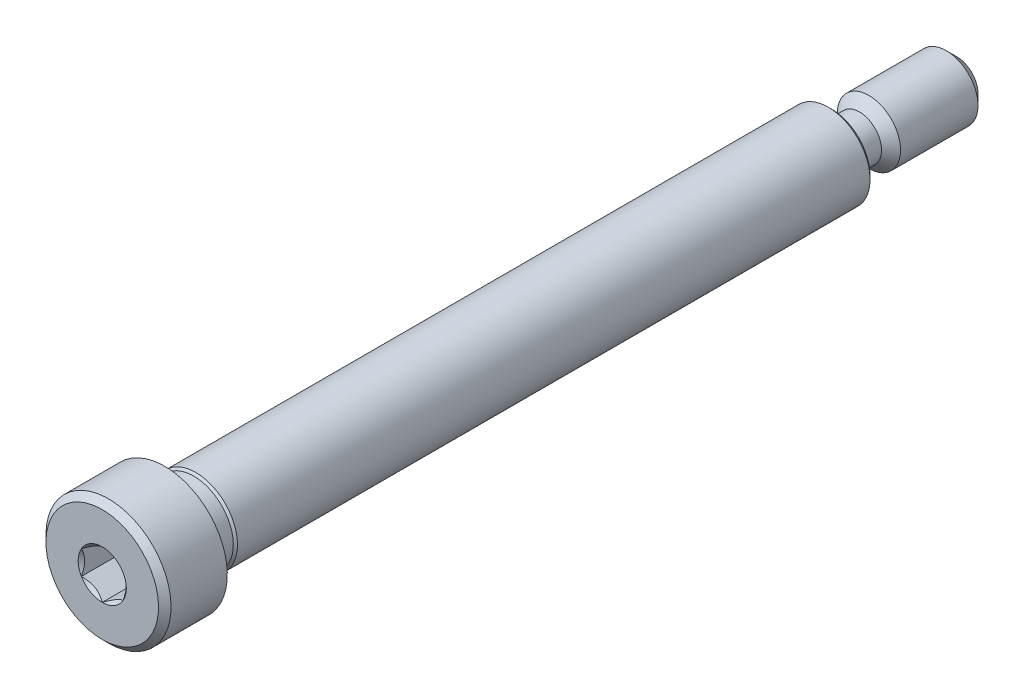
ISO-10303-21;
HEADER;
FILE_DESCRIPTION(('STEP AP214'),'2;1');
FILE_NAME('part.step','',(''),(''),'','','');
FILE_SCHEMA(('AUTOMOTIVE_DESIGN { 1 0 10303 214 1 1 1 1 }'));
ENDSEC;
DATA;
#1=APPLICATION_CONTEXT('core data for automotive mechanical design processes');
#2=APPLICATION_PROTOCOL_DEFINITION('international standard','automotive_design',2000,#1);
#3=PRODUCT_CONTEXT('',#1,'mechanical');
#4=PRODUCT('Part','Part','',(#3));
#5=PRODUCT_RELATED_PRODUCT_CATEGORY('part','',(#4));
#6=PRODUCT_DEFINITION_FORMATION('','',#4);
#7=PRODUCT_DEFINITION_CONTEXT('part definition',#1,'design');
#8=PRODUCT_DEFINITION('design','',#6,#7);
#9=PRODUCT_DEFINITION_SHAPE('','',#8);
#10=(LENGTH_UNIT() NAMED_UNIT(*) SI_UNIT(.MILLI.,.METRE.));
#11=(NAMED_UNIT(*) PLANE_ANGLE_UNIT() SI_UNIT($,.RADIAN.));
#12=(NAMED_UNIT(*) SI_UNIT($,.STERADIAN.) SOLID_ANGLE_UNIT());
#13=UNCERTAINTY_MEASURE_WITH_UNIT(LENGTH_MEASURE(1.E-05),#10,'distance_accuracy_value','');
#14=(GEOMETRIC_REPRESENTATION_CONTEXT(3) GLOBAL_UNCERTAINTY_ASSIGNED_CONTEXT((#13)) GLOBAL_UNIT_ASSIGNED_CONTEXT((#10,
#11,#12)) REPRESENTATION_CONTEXT('',''));
#15=CARTESIAN_POINT('',(0.,0.,0.));
#16=DIRECTION('',(0.,0.,1.));
#17=DIRECTION('',(1.,0.,0.));
#18=AXIS2_PLACEMENT_3D('',#15,#16,#17);
#19=CARTESIAN_POINT('',(0.,4.28625,32.54375));
#20=DIRECTION('',(0.,0.,-1.));
#21=DIRECTION('',(0.,1.,0.));
#22=AXIS2_PLACEMENT_3D('',#19,#20,#21);
#23=PLANE('',#22);
#24=CARTESIAN_POINT('',(0.,0.,32.54375));
#25=DIRECTION('',(0.,0.,1.));
#26=DIRECTION('',(1.,0.,0.));
#27=AXIS2_PLACEMENT_3D('',#24,#25,#26);
#28=CIRCLE('',#27,1.83308710467706);
#29=CARTESIAN_POINT('',(0.,1.83308710467706,32.54375));
#30=VERTEX_POINT('',#29);
#31=CARTESIAN_POINT('',(-1.5875,0.916543552338532,32.54375));
#32=VERTEX_POINT('',#31);
#33=EDGE_CURVE('E129',#30,#32,#28,.T.);
#34=ORIENTED_EDGE('',*,*,#33,.F.);
#35=CARTESIAN_POINT('',(1.5875,0.916543552338532,32.54375));
#36=VERTEX_POINT('',#35);
#37=EDGE_CURVE('E102',#36,#30,#28,.T.);
#38=ORIENTED_EDGE('',*,*,#37,.F.);
#39=CARTESIAN_POINT('',(1.5875,-0.916543552338532,32.54375));
#40=VERTEX_POINT('',#39);
#41=EDGE_CURVE('E92',#40,#36,#28,.T.);
#42=ORIENTED_EDGE('',*,*,#41,.F.);
#43=CARTESIAN_POINT('',(0.,-1.83308710467706,32.54375));
#44=VERTEX_POINT('',#43);
#45=EDGE_CURVE('E53',#44,#40,#28,.T.);
#46=ORIENTED_EDGE('',*,*,#45,.F.);
#47=CARTESIAN_POINT('',(-1.5875,-0.916543552338531,32.54375));
#48=VERTEX_POINT('',#47);
#49=EDGE_CURVE('E60',#48,#44,#28,.T.);
#50=ORIENTED_EDGE('',*,*,#49,.F.);
#51=EDGE_CURVE('E134',#32,#48,#28,.T.);
#52=ORIENTED_EDGE('',*,*,#51,.F.);
#53=EDGE_LOOP('',(#34,#38,#42,#46,#50,#52));
#54=FACE_BOUND('',#53,.T.);
#55=CARTESIAN_POINT('',(0.,0.,32.54375));
#56=DIRECTION('',(0.,0.,1.));
#57=DIRECTION('',(0.,-1.,0.));
#58=AXIS2_PLACEMENT_3D('',#55,#56,#57);
#59=CIRCLE('',#58,4.28625);
#60=CARTESIAN_POINT('',(0.,-4.28625,32.54375));
#61=VERTEX_POINT('',#60);
#62=EDGE_CURVE('E47',#61,#61,#59,.T.);
#63=ORIENTED_EDGE('',*,*,#62,.T.);
#64=EDGE_LOOP('',(#63));
#65=FACE_BOUND('',#64,.T.);
#66=ADVANCED_FACE('F39',(#54,#65),#23,.F.);
#67=CARTESIAN_POINT('',(0.,0.,32.0675));
#68=DIRECTION('',(0.,0.,-1.));
#69=DIRECTION('',(0.,1.,0.));
#70=AXIS2_PLACEMENT_3D('',#67,#68,#69);
#71=CONICAL_SURFACE('',#70,4.7625,0.785398163397444);
#72=ORIENTED_EDGE('',*,*,#62,.F.);
#73=EDGE_LOOP('',(#72));
#74=FACE_BOUND('',#73,.T.);
#75=CARTESIAN_POINT('',(0.,0.,32.0675));
#76=DIRECTION('',(0.,0.,1.));
#77=DIRECTION('',(0.,-1.,0.));
#78=AXIS2_PLACEMENT_3D('',#75,#76,#77);
#79=CIRCLE('',#78,4.7625);
#80=CARTESIAN_POINT('',(0.,-4.7625,32.0675));
#81=VERTEX_POINT('',#80);
#82=EDGE_CURVE('E304',#81,#81,#79,.T.);
#83=ORIENTED_EDGE('',*,*,#82,.T.);
#84=EDGE_LOOP('',(#83));
#85=FACE_BOUND('',#84,.T.);
#86=ADVANCED_FACE('F207',(#74,#85),#71,.T.);
#87=CARTESIAN_POINT('',(0.,0.,32.54375));
#88=DIRECTION('',(0.,0.,1.));
#89=DIRECTION('',(0.,-1.,0.));
#90=AXIS2_PLACEMENT_3D('',#87,#88,#89);
#91=CYLINDRICAL_SURFACE('',#90,4.7625);
#92=ORIENTED_EDGE('',*,*,#82,.F.);
#93=EDGE_LOOP('',(#92));
#94=FACE_BOUND('',#93,.T.);
#95=CARTESIAN_POINT('',(0.,0.,27.78125));
#96=DIRECTION('',(0.,0.,1.));
#97=DIRECTION('',(0.,-1.,0.));
#98=AXIS2_PLACEMENT_3D('',#95,#96,#97);
#99=CIRCLE('',#98,4.7625);
#100=CARTESIAN_POINT('',(0.,-4.7625,27.78125));
#101=VERTEX_POINT('',#100);
#102=EDGE_CURVE('E301',#101,#101,#99,.T.);
#103=ORIENTED_EDGE('',*,*,#102,.T.);
#104=EDGE_LOOP('',(#103));
#105=FACE_BOUND('',#104,.T.);
#106=ADVANCED_FACE('F211',(#94,#105),#91,.T.);
#107=CARTESIAN_POINT('',(0.,4.7625,27.78125));
#108=DIRECTION('',(0.,0.,1.));
#109=DIRECTION('',(0.,-1.,0.));
#110=AXIS2_PLACEMENT_3D('',#107,#108,#109);
#111=PLANE('',#110);
#112=ORIENTED_EDGE('',*,*,#102,.F.);
#113=EDGE_LOOP('',(#112));
#114=FACE_BOUND('',#113,.T.);
#115=CARTESIAN_POINT('',(0.,0.,27.78125));
#116=DIRECTION('',(0.,0.,1.));
#117=DIRECTION('',(0.,-1.,0.));
#118=AXIS2_PLACEMENT_3D('',#115,#116,#117);
#119=CIRCLE('',#118,3.175);
#120=CARTESIAN_POINT('',(0.,-3.175,27.78125));
#121=VERTEX_POINT('',#120);
#122=EDGE_CURVE('E298',#121,#121,#119,.T.);
#123=ORIENTED_EDGE('',*,*,#122,.T.);
#124=EDGE_LOOP('',(#123));
#125=FACE_BOUND('',#124,.T.);
#126=ADVANCED_FACE('F216',(#114,#125),#111,.F.);
#127=CARTESIAN_POINT('',(0.,0.,27.6225));
#128=DIRECTION('',(0.,0.,1.));
#129=DIRECTION('',(0.,-1.,0.));
#130=AXIS2_PLACEMENT_3D('',#127,#128,#129);
#131=CONICAL_SURFACE('',#130,3.01625,0.785398163397451);
#132=ORIENTED_EDGE('',*,*,#122,.F.);
#133=EDGE_LOOP('',(#132));
#134=FACE_BOUND('',#133,.T.);
#135=CARTESIAN_POINT('',(0.,0.,27.6225));
#136=DIRECTION('',(0.,0.,1.));
#137=DIRECTION('',(0.,-1.,0.));
#138=AXIS2_PLACEMENT_3D('',#135,#136,#137);
#139=CIRCLE('',#138,3.01625);
#140=CARTESIAN_POINT('',(0.,-3.01625,27.6225));
#141=VERTEX_POINT('',#140);
#142=EDGE_CURVE('E295',#141,#141,#139,.T.);
#143=ORIENTED_EDGE('',*,*,#142,.T.);
#144=EDGE_LOOP('',(#143));
#145=FACE_BOUND('',#144,.T.);
#146=ADVANCED_FACE('F224',(#134,#145),#131,.T.);
#147=CARTESIAN_POINT('',(0.,0.,32.54375));
#148=DIRECTION('',(0.,0.,1.));
#149=DIRECTION('',(0.,-1.,0.));
#150=AXIS2_PLACEMENT_3D('',#147,#148,#149);
#151=CYLINDRICAL_SURFACE('',#150,3.01625);
#152=ORIENTED_EDGE('',*,*,#142,.F.);
#153=EDGE_LOOP('',(#152));
#154=FACE_BOUND('',#153,.T.);
#155=CARTESIAN_POINT('',(0.,0.,25.5778));
#156=DIRECTION('',(0.,0.,1.));
#157=DIRECTION('',(0.,-1.,0.));
#158=AXIS2_PLACEMENT_3D('',#155,#156,#157);
#159=CIRCLE('',#158,3.01625);
#160=CARTESIAN_POINT('',(0.,-3.01625,25.5778));
#161=VERTEX_POINT('',#160);
#162=EDGE_CURVE('E292',#161,#161,#159,.T.);
#163=ORIENTED_EDGE('',*,*,#162,.T.);
#164=EDGE_LOOP('',(#163));
#165=FACE_BOUND('',#164,.T.);
#166=ADVANCED_FACE('F228',(#154,#165),#151,.T.);
#167=CARTESIAN_POINT('',(0.,0.,25.41905));
#168=DIRECTION('',(0.,0.,-1.));
#169=DIRECTION('',(0.,1.,0.));
#170=AXIS2_PLACEMENT_3D('',#167,#168,#169);
#171=CONICAL_SURFACE('',#170,3.175,0.785398163397407);
#172=ORIENTED_EDGE('',*,*,#162,.F.);
#173=EDGE_LOOP('',(#172));
#174=FACE_BOUND('',#173,.T.);
#175=CARTESIAN_POINT('',(0.,0.,25.41905));
#176=DIRECTION('',(0.,0.,1.));
#177=DIRECTION('',(0.,-1.,0.));
#178=AXIS2_PLACEMENT_3D('',#175,#176,#177);
#179=CIRCLE('',#178,3.175);
#180=CARTESIAN_POINT('',(0.,-3.175,25.41905));
#181=VERTEX_POINT('',#180);
#182=EDGE_CURVE('E289',#181,#181,#179,.T.);
#183=ORIENTED_EDGE('',*,*,#182,.T.);
#184=EDGE_LOOP('',(#183));
#185=FACE_BOUND('',#184,.T.);
#186=ADVANCED_FACE('F232',(#174,#185),#171,.T.);
#187=CARTESIAN_POINT('',(0.,0.,32.54375));
#188=DIRECTION('',(0.,0.,1.));
#189=DIRECTION('',(0.,-1.,0.));
#190=AXIS2_PLACEMENT_3D('',#187,#188,#189);
#191=CYLINDRICAL_SURFACE('',#190,3.175);
#192=ORIENTED_EDGE('',*,*,#182,.F.);
#193=EDGE_LOOP('',(#192));
#194=FACE_BOUND('',#193,.T.);
#195=CARTESIAN_POINT('',(0.,0.,-22.76475));
#196=DIRECTION('',(0.,0.,1.));
#197=DIRECTION('',(0.,-1.,0.));
#198=AXIS2_PLACEMENT_3D('',#195,#196,#197);
#199=CIRCLE('',#198,3.175);
#200=CARTESIAN_POINT('',(0.,-3.175,-22.76475));
#201=VERTEX_POINT('',#200);
#202=EDGE_CURVE('E286',#201,#201,#199,.T.);
#203=ORIENTED_EDGE('',*,*,#202,.T.);
#204=EDGE_LOOP('',(#203));
#205=FACE_BOUND('',#204,.T.);
#206=ADVANCED_FACE('F236',(#194,#205),#191,.T.);
#207=CARTESIAN_POINT('',(0.,0.,-23.01875));
#208=DIRECTION('',(0.,0.,1.));
#209=DIRECTION('',(0.,-1.,0.));
#210=AXIS2_PLACEMENT_3D('',#207,#208,#209);
#211=CONICAL_SURFACE('',#210,2.921,0.78539816339744);
#212=ORIENTED_EDGE('',*,*,#202,.F.);
#213=EDGE_LOOP('',(#212));
#214=FACE_BOUND('',#213,.T.);
#215=CARTESIAN_POINT('',(0.,0.,-23.01875));
#216=DIRECTION('',(0.,0.,1.));
#217=DIRECTION('',(0.,-1.,0.));
#218=AXIS2_PLACEMENT_3D('',#215,#216,#217);
#219=CIRCLE('',#218,2.921);
#220=CARTESIAN_POINT('',(0.,-2.921,-23.01875));
#221=VERTEX_POINT('',#220);
#222=EDGE_CURVE('E274',#221,#221,#219,.T.);
#223=ORIENTED_EDGE('',*,*,#222,.T.);
#224=EDGE_LOOP('',(#223));
#225=FACE_BOUND('',#224,.T.);
#226=ADVANCED_FACE('F240',(#214,#225),#211,.T.);
#227=CARTESIAN_POINT('',(0.,2.921,-23.01875));
#228=DIRECTION('',(0.,0.,1.));
#229=DIRECTION('',(0.,-1.,0.));
#230=AXIS2_PLACEMENT_3D('',#227,#228,#229);
#231=PLANE('',#230);
#232=CARTESIAN_POINT('',(0.,0.,-23.01875));
#233=DIRECTION('',(0.,0.,-1.));
#234=DIRECTION('',(0.,1.,0.));
#235=AXIS2_PLACEMENT_3D('',#232,#233,#234);
#236=CIRCLE('',#235,2.413);
#237=CARTESIAN_POINT('',(0.,2.413,-23.01875));
#238=VERTEX_POINT('',#237);
#239=EDGE_CURVE('E588',#238,#238,#236,.T.);
#240=ORIENTED_EDGE('',*,*,#239,.F.);
#241=EDGE_LOOP('',(#240));
#242=FACE_BOUND('',#241,.T.);
#243=ORIENTED_EDGE('',*,*,#222,.F.);
#244=EDGE_LOOP('',(#243));
#245=FACE_BOUND('',#244,.T.);
#246=ADVANCED_FACE('F244',(#242,#245),#231,.F.);
#247=CARTESIAN_POINT('',(0.,0.,32.54375));
#248=DIRECTION('',(0.,0.,1.));
#249=DIRECTION('',(1.,0.,0.));
#250=AXIS2_PLACEMENT_3D('',#247,#248,#249);
#251=CONICAL_SURFACE('',#250,1.83308710467706,0.78539816339745);
#252=ORIENTED_EDGE('',*,*,#37,.T.);
#253=CARTESIAN_POINT('',(1.5877,0.916428082284693,32.5438654809637));
#254=CARTESIAN_POINT('',(1.53312479190086,0.947937093371809,32.5123808083706));
#255=CARTESIAN_POINT('',(1.47763696320971,0.979973006203394,32.4827450460135));
#256=CARTESIAN_POINT('',(1.36449087915364,1.04529792829092,32.4284822600208));
#257=CARTESIAN_POINT('',(1.30682185887062,1.07859315267522,32.4038854351332));
#258=CARTESIAN_POINT('',(1.1905349781269,1.14573141457583,32.3617503642726));
#259=CARTESIAN_POINT('',(1.13194674474407,1.17955734689075,32.3441061927298));
#260=CARTESIAN_POINT('',(1.01348022674557,1.24795402294715,32.316921470085));
#261=CARTESIAN_POINT('',(0.953605562983895,1.28252267618759,32.3073606206951));
#262=CARTESIAN_POINT('',(0.850418771876558,1.34209759781022,32.298734413104));
#263=CARTESIAN_POINT('',(0.807240015952288,1.36702686416637,32.2974571928096));
#264=CARTESIAN_POINT('',(0.720953038535399,1.41684467380557,32.2996070558147));
#265=CARTESIAN_POINT('',(0.677844847078612,1.44173319974742,32.3030357885493));
#266=CARTESIAN_POINT('',(0.592046335002031,1.49126899379091,32.3144009944333));
#267=CARTESIAN_POINT('',(0.549356408925407,1.51591603410293,32.3223413718016));
#268=CARTESIAN_POINT('',(0.464693063478359,1.56479643938728,32.3422984144511));
#269=CARTESIAN_POINT('',(0.422719959755075,1.58902962212064,32.3543168292087));
#270=CARTESIAN_POINT('',(0.315211458113567,1.65109968448354,32.3899968972473));
#271=CARTESIAN_POINT('',(0.250342771708901,1.68855163804125,32.4163485723031));
#272=CARTESIAN_POINT('',(0.154961599380924,1.74361998356043,32.4608335368517));
#273=CARTESIAN_POINT('',(0.123530699536156,1.76176662204668,32.4764628578011));
#274=CARTESIAN_POINT('',(0.0612469855696356,1.79772614107138,32.5091484878611));
#275=CARTESIAN_POINT('',(0.030393903960575,1.8155391760437,32.526204115657));
#276=CARTESIAN_POINT('',(-0.000200000000001308,1.8332025747309,32.5438654809637));
#277=B_SPLINE_CURVE_WITH_KNOTS('',3,(#253,#254,#255,#256,#257,#258,#259,#260,#261,#262,#263,
#264,#265,#266,#267,#268,#269,#270,#271,#272,#273,#274,#275,#276),.UNSPECIFIED.,.F.,.F.,(4,2,2,
2,2,2,2,2,2,2,2,4),(0.,0.211482650810816,0.424197870807277,0.633533884524819,0.842342653263348,
0.991755553727141,1.14122083674205,1.29081565918877,1.44047473906438,1.6781878086972,
1.79671410024894,1.91518409436631),.UNSPECIFIED.);
#278=EDGE_CURVE('E11',#36,#30,#277,.T.);
#279=ORIENTED_EDGE('',*,*,#278,.F.);
#280=EDGE_LOOP('',(#252,#279));
#281=FACE_BOUND('',#280,.T.);
#282=ADVANCED_FACE('F105',(#281),#251,.F.);
#283=ORIENTED_EDGE('',*,*,#33,.T.);
#284=CARTESIAN_POINT('',(0.000199999999999792,1.8332025747309,32.5438654809637));
#285=CARTESIAN_POINT('',(-0.0543752080991364,1.80169356364378,32.5123808083706));
#286=CARTESIAN_POINT('',(-0.10986303679029,1.7696576508122,32.4827450460135));
#287=CARTESIAN_POINT('',(-0.223009120846359,1.70433272872468,32.4284822600208));
#288=CARTESIAN_POINT('',(-0.280678141129381,1.67103750434037,32.4038854351332));
#289=CARTESIAN_POINT('',(-0.396965021873104,1.60389924243976,32.3617503642726));
#290=CARTESIAN_POINT('',(-0.455553255255931,1.57007331012484,32.3441061927298));
#291=CARTESIAN_POINT('',(-0.574019773254431,1.50167663406845,32.316921470085));
#292=CARTESIAN_POINT('',(-0.633894437016104,1.46710798082801,32.3073606206951));
#293=CARTESIAN_POINT('',(-0.737081228123441,1.40753305920537,32.298734413104));
#294=CARTESIAN_POINT('',(-0.780259984047711,1.38260379284922,32.2974571928096));
#295=CARTESIAN_POINT('',(-0.8665469614646,1.33278598321002,32.2996070558147));
#296=CARTESIAN_POINT('',(-0.909655152921387,1.30789745726817,32.3030357885493));
#297=CARTESIAN_POINT('',(-0.995453664997968,1.25836166322469,32.3144009944333));
#298=CARTESIAN_POINT('',(-1.03814359107459,1.23371462291266,32.3223413718016));
#299=CARTESIAN_POINT('',(-1.12280693652164,1.18483421762831,32.3422984144511));
#300=CARTESIAN_POINT('',(-1.16478004024492,1.16060103489495,32.3543168292087));
#301=CARTESIAN_POINT('',(-1.27228854188643,1.09853097253205,32.3899968972473));
#302=CARTESIAN_POINT('',(-1.3371572282911,1.06107901897434,32.4163485723031));
#303=CARTESIAN_POINT('',(-1.43253840061908,1.00601067345516,32.4608335368517));
#304=CARTESIAN_POINT('',(-1.46396930046384,0.987864034968914,32.4764628578011));
#305=CARTESIAN_POINT('',(-1.52625301443036,0.951904515944214,32.5091484878611));
#306=CARTESIAN_POINT('',(-1.55710609603942,0.934091480971893,32.526204115657));
#307=CARTESIAN_POINT('',(-1.5877,0.916428082284693,32.5438654809637));
#308=B_SPLINE_CURVE_WITH_KNOTS('',3,(#284,#285,#286,#287,#288,#289,#290,#291,#292,#293,#294,
#295,#296,#297,#298,#299,#300,#301,#302,#303,#304,#305,#306,#307),.UNSPECIFIED.,.F.,.F.,(4,2,2,
2,2,2,2,2,2,2,2,4),(0.,0.211482650810817,0.424197870807277,0.633533884524815,0.842342653263347,
0.99175555372714,1.14122083674204,1.29081565918877,1.44047473906438,1.6781878086972,
1.79671410024894,1.91518409436631),.UNSPECIFIED.);
#309=EDGE_CURVE('E130',#30,#32,#308,.T.);
#310=ORIENTED_EDGE('',*,*,#309,.F.);
#311=EDGE_LOOP('',(#283,#310));
#312=FACE_BOUND('',#311,.T.);
#313=ADVANCED_FACE('F337',(#312),#251,.F.);
#314=ORIENTED_EDGE('',*,*,#51,.T.);
#315=CARTESIAN_POINT('',(-1.5875,-1.82796193726258,33.1317372630533));
#316=CARTESIAN_POINT('',(-1.5875,-1.78345227615058,33.0981366524824));
#317=CARTESIAN_POINT('',(-1.5875,-1.73869460859012,33.0648654951128));
#318=CARTESIAN_POINT('',(-1.5875,-1.64858256596371,32.9991181176639));
#319=CARTESIAN_POINT('',(-1.5875,-1.60322804392556,32.9666420992359));
#320=CARTESIAN_POINT('',(-1.5875,-1.4654544197676,32.8701476119854));
#321=CARTESIAN_POINT('',(-1.5875,-1.37200191342499,32.80758016346));
#322=CARTESIAN_POINT('',(-1.5875,-1.17603564989744,32.684752804435));
#323=CARTESIAN_POINT('',(-1.5875,-1.07330915468726,32.6248284496591));
#324=CARTESIAN_POINT('',(-1.5875,-0.862725191083293,32.5152140326728));
#325=CARTESIAN_POINT('',(-1.5875,-0.754886591626389,32.4654894689649));
#326=CARTESIAN_POINT('',(-1.5875,-0.593019911814787,32.4046560740893));
#327=CARTESIAN_POINT('',(-1.5875,-0.541388281953339,32.3871964520431));
#328=CARTESIAN_POINT('',(-1.5875,-0.436878539644846,32.3564223678478));
#329=CARTESIAN_POINT('',(-1.5875,-0.384000341596418,32.343108191262));
#330=CARTESIAN_POINT('',(-1.5875,-0.278196924179272,32.321538305472));
#331=CARTESIAN_POINT('',(-1.5875,-0.225289653780157,32.3131959279895));
#332=CARTESIAN_POINT('',(-1.5875,-0.118909299444437,32.3017325177005));
#333=CARTESIAN_POINT('',(-1.5875,-0.0654363143610342,32.2986105873549));
#334=CARTESIAN_POINT('',(-1.5875,0.0396125417767683,32.2978196410921));
#335=CARTESIAN_POINT('',(-1.5875,0.091187023620311,32.2999573430156));
#336=CARTESIAN_POINT('',(-1.5875,0.193894009138669,32.3091413684824));
#337=CARTESIAN_POINT('',(-1.5875,0.245026469388829,32.316188168875));
#338=CARTESIAN_POINT('',(-1.5875,0.347344844875249,32.3349252166964));
#339=CARTESIAN_POINT('',(-1.5875,0.398516068928429,32.3466944835804));
#340=CARTESIAN_POINT('',(-1.5875,0.499740446124591,32.3742509465349));
#341=CARTESIAN_POINT('',(-1.5875,0.549793692439815,32.39003780641));
#342=CARTESIAN_POINT('',(-1.5875,0.707380774187257,32.4456797783059));
#343=CARTESIAN_POINT('',(-1.5875,0.812671634229882,32.4918718625745));
#344=CARTESIAN_POINT('',(-1.5875,1.01830702558101,32.5945743359444));
#345=CARTESIAN_POINT('',(-1.5875,1.11863208625861,32.6511217955531));
#346=CARTESIAN_POINT('',(-1.5875,1.31036772822829,32.7677841933715));
#347=CARTESIAN_POINT('',(-1.5875,1.40197355475198,32.8275822160727));
#348=CARTESIAN_POINT('',(-1.5875,1.53693633949295,32.9200238025041));
#349=CARTESIAN_POINT('',(-1.5875,1.58134147344182,32.9511636279364));
#350=CARTESIAN_POINT('',(-1.5875,1.66954488852478,33.0142668197706));
#351=CARTESIAN_POINT('',(-1.5875,1.71334333318449,33.0462299573449));
#352=CARTESIAN_POINT('',(-1.5875,1.75688919237297,33.0785344890283));
#353=B_SPLINE_CURVE_WITH_KNOTS('',3,(#315,#316,#317,#318,#319,#320,#321,#322,#323,#324,#325,
#326,#327,#328,#329,#330,#331,#332,#333,#334,#335,#336,#337,#338,#339,#340,#341,#342,#343,#344,
#345,#346,#347,#348,#349,#350,#351,#352),.UNSPECIFIED.,.F.,.F.,(4,2,2,2,2,2,2,2,2,2,2,2,2,2,2,2,
2,2,4),(0.,0.167300856006662,0.334643709885261,0.671883358358865,1.02837224619093,
1.38363464340873,1.54700775526169,1.7103921187555,1.87083807337658,2.03125644006702,
2.18586834446826,2.340495269317,2.49782525404181,2.65514207759267,2.99906299922328,
3.3442400622648,3.67226428573991,3.8349649830897,3.9976209379619),.UNSPECIFIED.);
#354=EDGE_CURVE('E132',#32,#48,#353,.F.);
#355=ORIENTED_EDGE('',*,*,#354,.F.);
#356=EDGE_LOOP('',(#314,#355));
#357=FACE_BOUND('',#356,.T.);
#358=ADVANCED_FACE('F330',(#357),#251,.F.);
#359=ORIENTED_EDGE('',*,*,#49,.T.);
#360=CARTESIAN_POINT('',(-1.5877,-0.916428082284692,32.5438654809637));
#361=CARTESIAN_POINT('',(-1.53312479190087,-0.947937093371808,32.5123808083706));
#362=CARTESIAN_POINT('',(-1.47763696320971,-0.979973006203393,32.4827450460135));
#363=CARTESIAN_POINT('',(-1.36449087915364,-1.04529792829092,32.4284822600208));
#364=CARTESIAN_POINT('',(-1.30682185887062,-1.07859315267522,32.4038854351332));
#365=CARTESIAN_POINT('',(-1.1905349781269,-1.14573141457583,32.3617503642726));
#366=CARTESIAN_POINT('',(-1.13194674474407,-1.17955734689075,32.3441061927298));
#367=CARTESIAN_POINT('',(-1.01348022674557,-1.24795402294714,32.316921470085));
#368=CARTESIAN_POINT('',(-0.953605562983896,-1.28252267618758,32.3073606206951));
#369=CARTESIAN_POINT('',(-0.850418771876558,-1.34209759781022,32.298734413104));
#370=CARTESIAN_POINT('',(-0.807240015952289,-1.36702686416637,32.2974571928096));
#371=CARTESIAN_POINT('',(-0.7209530385354,-1.41684467380557,32.2996070558147));
#372=CARTESIAN_POINT('',(-0.677844847078613,-1.44173319974742,32.3030357885493));
#373=CARTESIAN_POINT('',(-0.592046335002032,-1.49126899379091,32.3144009944333));
#374=CARTESIAN_POINT('',(-0.549356408925407,-1.51591603410293,32.3223413718016));
#375=CARTESIAN_POINT('',(-0.46469306347836,-1.56479643938728,32.3422984144511));
#376=CARTESIAN_POINT('',(-0.422719959755076,-1.58902962212064,32.3543168292087));
#377=CARTESIAN_POINT('',(-0.315211458113567,-1.65109968448354,32.3899968972473));
#378=CARTESIAN_POINT('',(-0.250342771708901,-1.68855163804125,32.4163485723031));
#379=CARTESIAN_POINT('',(-0.154961599380924,-1.74361998356043,32.4608335368517));
#380=CARTESIAN_POINT('',(-0.123530699536156,-1.76176662204668,32.4764628578011));
#381=CARTESIAN_POINT('',(-0.0612469855696358,-1.79772614107138,32.5091484878611));
#382=CARTESIAN_POINT('',(-0.0303939039605753,-1.8155391760437,32.526204115657));
#383=CARTESIAN_POINT('',(0.000200000000000904,-1.8332025747309,32.5438654809637));
#384=B_SPLINE_CURVE_WITH_KNOTS('',3,(#360,#361,#362,#363,#364,#365,#366,#367,#368,#369,#370,
#371,#372,#373,#374,#375,#376,#377,#378,#379,#380,#381,#382,#383),.UNSPECIFIED.,.F.,.F.,(4,2,2,
2,2,2,2,2,2,2,2,4),(0.,0.211482650810816,0.424197870807276,0.633533884524816,0.842342653263349,
0.991755553727142,1.14122083674205,1.29081565918877,1.44047473906438,1.6781878086972,
1.79671410024894,1.91518409436631),.UNSPECIFIED.);
#385=EDGE_CURVE('E172',#48,#44,#384,.T.);
#386=ORIENTED_EDGE('',*,*,#385,.F.);
#387=EDGE_LOOP('',(#359,#386));
#388=FACE_BOUND('',#387,.T.);
#389=ADVANCED_FACE('F331',(#388),#251,.F.);
#390=ORIENTED_EDGE('',*,*,#45,.T.);
#391=CARTESIAN_POINT('',(-0.000200000000000932,-1.8332025747309,32.5438654809637));
#392=CARTESIAN_POINT('',(0.0543752080991347,-1.80169356364378,32.5123808083706));
#393=CARTESIAN_POINT('',(0.109863036790288,-1.7696576508122,32.4827450460135));
#394=CARTESIAN_POINT('',(0.223009120846358,-1.70433272872468,32.4284822600208));
#395=CARTESIAN_POINT('',(0.28067814112938,-1.67103750434037,32.4038854351332));
#396=CARTESIAN_POINT('',(0.396965021873103,-1.60389924243976,32.3617503642726));
#397=CARTESIAN_POINT('',(0.455553255255931,-1.57007331012484,32.3441061927298));
#398=CARTESIAN_POINT('',(0.574019773254431,-1.50167663406845,32.316921470085));
#399=CARTESIAN_POINT('',(0.633894437016104,-1.46710798082801,32.3073606206951));
#400=CARTESIAN_POINT('',(0.737081228123441,-1.40753305920537,32.298734413104));
#401=CARTESIAN_POINT('',(0.780259984047711,-1.38260379284922,32.2974571928096));
#402=CARTESIAN_POINT('',(0.8665469614646,-1.33278598321002,32.2996070558147));
#403=CARTESIAN_POINT('',(0.909655152921387,-1.30789745726817,32.3030357885493));
#404=CARTESIAN_POINT('',(0.995453664997968,-1.25836166322469,32.3144009944333));
#405=CARTESIAN_POINT('',(1.03814359107459,-1.23371462291266,32.3223413718016));
#406=CARTESIAN_POINT('',(1.12280693652164,-1.18483421762831,32.3422984144511));
#407=CARTESIAN_POINT('',(1.16478004024492,-1.16060103489495,32.3543168292087));
#408=CARTESIAN_POINT('',(1.27228854188643,-1.09853097253205,32.3899968972473));
#409=CARTESIAN_POINT('',(1.3371572282911,-1.06107901897434,32.4163485723031));
#410=CARTESIAN_POINT('',(1.43253840061908,-1.00601067345516,32.4608335368517));
#411=CARTESIAN_POINT('',(1.46396930046384,-0.987864034968914,32.4764628578011));
#412=CARTESIAN_POINT('',(1.52625301443036,-0.951904515944213,32.5091484878611));
#413=CARTESIAN_POINT('',(1.55710609603942,-0.934091480971893,32.526204115657));
#414=CARTESIAN_POINT('',(1.5877,-0.916428082284693,32.5438654809637));
#415=B_SPLINE_CURVE_WITH_KNOTS('',3,(#391,#392,#393,#394,#395,#396,#397,#398,#399,#400,#401,
#402,#403,#404,#405,#406,#407,#408,#409,#410,#411,#412,#413,#414),.UNSPECIFIED.,.F.,.F.,(4,2,2,
2,2,2,2,2,2,2,2,4),(0.,0.211482650810816,0.424197870807277,0.633533884524819,0.842342653263349,
0.991755553727142,1.14122083674205,1.29081565918877,1.44047473906438,1.6781878086972,
1.79671410024894,1.91518409436631),.UNSPECIFIED.);
#416=EDGE_CURVE('E117',#44,#40,#415,.T.);
#417=ORIENTED_EDGE('',*,*,#416,.F.);
#418=EDGE_LOOP('',(#390,#417));
#419=FACE_BOUND('',#418,.T.);
#420=ADVANCED_FACE('F158',(#419),#251,.F.);
#421=ORIENTED_EDGE('',*,*,#41,.T.);
#422=CARTESIAN_POINT('',(1.5875,-1.82796193752854,33.1317372632541));
#423=CARTESIAN_POINT('',(1.5875,-1.78345227640909,33.0981366526755));
#424=CARTESIAN_POINT('',(1.5875,-1.73869460884114,33.0648654952982));
#425=CARTESIAN_POINT('',(1.5875,-1.64858256619969,32.9991181178338));
#426=CARTESIAN_POINT('',(1.5875,-1.60322804415398,32.9666420993982));
#427=CARTESIAN_POINT('',(1.5875,-1.46545441997287,32.8701476121245));
#428=CARTESIAN_POINT('',(1.5875,-1.37200191361453,32.8075801635837));
#429=CARTESIAN_POINT('',(1.5875,-1.17603565005265,32.684752804527));
#430=CARTESIAN_POINT('',(1.5875,-1.0733091548238,32.624828449735));
#431=CARTESIAN_POINT('',(1.5875,-0.862725191180885,32.5152140327188));
#432=CARTESIAN_POINT('',(1.5875,-0.754886591703731,32.4654894689971));
#433=CARTESIAN_POINT('',(1.5875,-0.593019911876895,32.4046560741112));
#434=CARTESIAN_POINT('',(1.5875,-0.541388282021826,32.3871964520654));
#435=CARTESIAN_POINT('',(1.5875,-0.436878539726302,32.3564223678696));
#436=CARTESIAN_POINT('',(1.5875,-0.384000341684462,32.3431081912829));
#437=CARTESIAN_POINT('',(1.5875,-0.278196924280275,32.3215383054897));
#438=CARTESIAN_POINT('',(1.5875,-0.225289653887529,32.3131959280048));
#439=CARTESIAN_POINT('',(1.5875,-0.118909299564332,32.3017325177097));
#440=CARTESIAN_POINT('',(1.5875,-0.0654363144870844,32.2986105873603));
#441=CARTESIAN_POINT('',(1.5875,0.0396125416393621,32.2978196410889));
#442=CARTESIAN_POINT('',(1.5875,0.0911870234776879,32.2999573430076));
#443=CARTESIAN_POINT('',(1.5875,0.193894008986134,32.309141368464));
#444=CARTESIAN_POINT('',(1.5875,0.245026469231598,32.3161881688511));
#445=CARTESIAN_POINT('',(1.5875,0.347344844708747,32.3349252166609));
#446=CARTESIAN_POINT('',(1.5875,0.398516068757365,32.3466944835388));
#447=CARTESIAN_POINT('',(1.5875,0.499740445944846,32.374250946481));
#448=CARTESIAN_POINT('',(1.5875,0.549793692255952,32.3900378063498));
#449=CARTESIAN_POINT('',(1.5875,0.70738077396336,32.4456797782163));
#450=CARTESIAN_POINT('',(1.5875,0.812671633972076,32.4918718624579));
#451=CARTESIAN_POINT('',(1.5875,1.01830702525799,32.5945743357708));
#452=CARTESIAN_POINT('',(1.5875,1.1186320859043,32.6511217953495));
#453=CARTESIAN_POINT('',(1.5875,1.31036772781773,32.7677841931104));
#454=CARTESIAN_POINT('',(1.5875,1.40197355431624,32.8275822157844));
#455=CARTESIAN_POINT('',(1.5875,1.53693633902001,32.9200238021751));
#456=CARTESIAN_POINT('',(1.5875,1.58134147295665,32.951163627594));
#457=CARTESIAN_POINT('',(1.5875,1.66954488801524,33.0142668194013));
#458=CARTESIAN_POINT('',(1.5875,1.71334333266281,33.0462299569622));
#459=CARTESIAN_POINT('',(1.5875,1.75688919183916,33.0785344886323));
#460=B_SPLINE_CURVE_WITH_KNOTS('',3,(#422,#423,#424,#425,#426,#427,#428,#429,#430,#431,#432,
#433,#434,#435,#436,#437,#438,#439,#440,#441,#442,#443,#444,#445,#446,#447,#448,#449,#450,#451,
#452,#453,#454,#455,#456,#457,#458,#459),.UNSPECIFIED.,.F.,.F.,(4,2,2,2,2,2,2,2,2,2,2,2,2,2,2,2,
2,2,4),(0.,0.167300856038502,0.334643709948952,0.67188335848746,1.02837224639231,
1.38363464368219,1.5470077555167,1.71039211899209,1.87083807359551,2.03125644026828,
2.18586834465336,2.34049526948591,2.49782525419329,2.65514207772674,2.99906299923217,
3.34424006214767,3.67226428551496,3.83496498281158,3.9976209376306),.UNSPECIFIED.);
#461=EDGE_CURVE('E96',#40,#36,#460,.T.);
#462=ORIENTED_EDGE('',*,*,#461,.F.);
#463=EDGE_LOOP('',(#421,#462));
#464=FACE_BOUND('',#463,.T.);
#465=ADVANCED_FACE('F94',(#464),#251,.F.);
#466=CARTESIAN_POINT('',(0.,0.,28.971875));
#467=DIRECTION('',(0.,0.,1.));
#468=DIRECTION('',(1.,0.,0.));
#469=AXIS2_PLACEMENT_3D('',#466,#467,#468);
#470=PLANE('',#469);
#471=DIRECTION('',(0.,1.,0.));
#472=VECTOR('',#471,1.);
#473=CARTESIAN_POINT('',(1.5875,-0.916543552338531,28.971875));
#474=LINE('',#473,#472);
#475=CARTESIAN_POINT('',(1.5875,-0.916543552338531,28.971875));
#476=VERTEX_POINT('',#475);
#477=CARTESIAN_POINT('',(1.5875,0.916543552338532,28.971875));
#478=VERTEX_POINT('',#477);
#479=EDGE_CURVE('E116',#476,#478,#474,.T.);
#480=ORIENTED_EDGE('',*,*,#479,.T.);
#481=DIRECTION('',(-0.866025403784439,0.5,0.));
#482=VECTOR('',#481,1.);
#483=CARTESIAN_POINT('',(1.5875,0.916543552338532,28.971875));
#484=LINE('',#483,#482);
#485=CARTESIAN_POINT('',(0.,1.83308710467706,28.971875));
#486=VERTEX_POINT('',#485);
#487=EDGE_CURVE('E121',#478,#486,#484,.T.);
#488=ORIENTED_EDGE('',*,*,#487,.T.);
#489=DIRECTION('',(-0.866025403784439,-0.5,0.));
#490=VECTOR('',#489,1.);
#491=CARTESIAN_POINT('',(0.,1.83308710467706,28.971875));
#492=LINE('',#491,#490);
#493=CARTESIAN_POINT('',(-1.5875,0.916543552338531,28.971875));
#494=VERTEX_POINT('',#493);
#495=EDGE_CURVE('E263',#486,#494,#492,.T.);
#496=ORIENTED_EDGE('',*,*,#495,.T.);
#497=DIRECTION('',(0.,-1.,0.));
#498=VECTOR('',#497,1.);
#499=CARTESIAN_POINT('',(-1.5875,0.916543552338531,28.971875));
#500=LINE('',#499,#498);
#501=CARTESIAN_POINT('',(-1.5875,-0.91654355233853,28.971875));
#502=VERTEX_POINT('',#501);
#503=EDGE_CURVE('E267',#494,#502,#500,.T.);
#504=ORIENTED_EDGE('',*,*,#503,.T.);
#505=DIRECTION('',(0.866025403784438,-0.5,0.));
#506=VECTOR('',#505,1.);
#507=CARTESIAN_POINT('',(-1.5875,-0.91654355233853,28.971875));
#508=LINE('',#507,#506);
#509=CARTESIAN_POINT('',(0.,-1.83308710467706,28.971875));
#510=VERTEX_POINT('',#509);
#511=EDGE_CURVE('E270',#502,#510,#508,.T.);
#512=ORIENTED_EDGE('',*,*,#511,.T.);
#513=DIRECTION('',(0.866025403784439,0.5,0.));
#514=VECTOR('',#513,1.);
#515=CARTESIAN_POINT('',(0.,-1.83308710467706,28.971875));
#516=LINE('',#515,#514);
#517=EDGE_CURVE('E124',#510,#476,#516,.T.);
#518=ORIENTED_EDGE('',*,*,#517,.T.);
#519=EDGE_LOOP('',(#480,#488,#496,#504,#512,#518));
#520=FACE_BOUND('',#519,.T.);
#521=ADVANCED_FACE('F157',(#520),#470,.T.);
#522=CARTESIAN_POINT('',(1.5875,0.916543552338532,28.971875));
#523=DIRECTION('',(0.5,0.866025403784439,0.));
#524=DIRECTION('',(-0.866025403784439,0.5,0.));
#525=AXIS2_PLACEMENT_3D('',#522,#523,#524);
#526=PLANE('',#525);
#527=DIRECTION('',(0.,0.,1.));
#528=VECTOR('',#527,1.);
#529=CARTESIAN_POINT('',(1.5875,0.916543552338532,28.971875));
#530=LINE('',#529,#528);
#531=EDGE_CURVE('E113',#478,#36,#530,.T.);
#532=ORIENTED_EDGE('',*,*,#531,.T.);
#533=ORIENTED_EDGE('',*,*,#278,.T.);
#534=DIRECTION('',(0.,0.,1.));
#535=VECTOR('',#534,1.);
#536=CARTESIAN_POINT('',(0.,1.83308710467706,28.971875));
#537=LINE('',#536,#535);
#538=EDGE_CURVE('E123',#486,#30,#537,.T.);
#539=ORIENTED_EDGE('',*,*,#538,.F.);
#540=ORIENTED_EDGE('',*,*,#487,.F.);
#541=EDGE_LOOP('',(#532,#533,#539,#540));
#542=FACE_BOUND('',#541,.T.);
#543=ADVANCED_FACE('F119',(#542),#526,.F.);
#544=CARTESIAN_POINT('',(0.,1.83308710467706,28.971875));
#545=DIRECTION('',(-0.5,0.866025403784439,0.));
#546=DIRECTION('',(-0.866025403784439,-0.5,0.));
#547=AXIS2_PLACEMENT_3D('',#544,#545,#546);
#548=PLANE('',#547);
#549=ORIENTED_EDGE('',*,*,#538,.T.);
#550=ORIENTED_EDGE('',*,*,#309,.T.);
#551=DIRECTION('',(0.,0.,1.));
#552=VECTOR('',#551,1.);
#553=CARTESIAN_POINT('',(-1.5875,0.916543552338531,28.971875));
#554=LINE('',#553,#552);
#555=EDGE_CURVE('E281',#494,#32,#554,.T.);
#556=ORIENTED_EDGE('',*,*,#555,.F.);
#557=ORIENTED_EDGE('',*,*,#495,.F.);
#558=EDGE_LOOP('',(#549,#550,#556,#557));
#559=FACE_BOUND('',#558,.T.);
#560=ADVANCED_FACE('F150',(#559),#548,.F.);
#561=CARTESIAN_POINT('',(-1.5875,0.916543552338531,28.971875));
#562=DIRECTION('',(-1.,0.,0.));
#563=DIRECTION('',(0.,-1.,0.));
#564=AXIS2_PLACEMENT_3D('',#561,#562,#563);
#565=PLANE('',#564);
#566=ORIENTED_EDGE('',*,*,#555,.T.);
#567=ORIENTED_EDGE('',*,*,#354,.T.);
#568=DIRECTION('',(0.,0.,1.));
#569=VECTOR('',#568,1.);
#570=CARTESIAN_POINT('',(-1.5875,-0.91654355233853,28.971875));
#571=LINE('',#570,#569);
#572=EDGE_CURVE('E278',#502,#48,#571,.T.);
#573=ORIENTED_EDGE('',*,*,#572,.F.);
#574=ORIENTED_EDGE('',*,*,#503,.F.);
#575=EDGE_LOOP('',(#566,#567,#573,#574));
#576=FACE_BOUND('',#575,.T.);
#577=ADVANCED_FACE('F196',(#576),#565,.F.);
#578=CARTESIAN_POINT('',(-1.5875,-0.91654355233853,28.971875));
#579=DIRECTION('',(-0.5,-0.866025403784439,0.));
#580=DIRECTION('',(0.866025403784439,-0.5,0.));
#581=AXIS2_PLACEMENT_3D('',#578,#579,#580);
#582=PLANE('',#581);
#583=ORIENTED_EDGE('',*,*,#572,.T.);
#584=ORIENTED_EDGE('',*,*,#385,.T.);
#585=DIRECTION('',(0.,0.,1.));
#586=VECTOR('',#585,1.);
#587=CARTESIAN_POINT('',(0.,-1.83308710467706,28.971875));
#588=LINE('',#587,#586);
#589=EDGE_CURVE('E275',#510,#44,#588,.T.);
#590=ORIENTED_EDGE('',*,*,#589,.F.);
#591=ORIENTED_EDGE('',*,*,#511,.F.);
#592=EDGE_LOOP('',(#583,#584,#590,#591));
#593=FACE_BOUND('',#592,.T.);
#594=ADVANCED_FACE('F192',(#593),#582,.F.);
#595=CARTESIAN_POINT('',(0.,-1.83308710467706,28.971875));
#596=DIRECTION('',(0.5,-0.866025403784439,0.));
#597=DIRECTION('',(0.866025403784439,0.5,0.));
#598=AXIS2_PLACEMENT_3D('',#595,#596,#597);
#599=PLANE('',#598);
#600=ORIENTED_EDGE('',*,*,#589,.T.);
#601=ORIENTED_EDGE('',*,*,#416,.T.);
#602=DIRECTION('',(0.,0.,1.));
#603=VECTOR('',#602,1.);
#604=CARTESIAN_POINT('',(1.5875,-0.916543552338531,28.971875));
#605=LINE('',#604,#603);
#606=EDGE_CURVE('E115',#476,#40,#605,.T.);
#607=ORIENTED_EDGE('',*,*,#606,.F.);
#608=ORIENTED_EDGE('',*,*,#517,.F.);
#609=EDGE_LOOP('',(#600,#601,#607,#608));
#610=FACE_BOUND('',#609,.T.);
#611=ADVANCED_FACE('F189',(#610),#599,.F.);
#612=CARTESIAN_POINT('',(1.5875,-0.916543552338531,28.971875));
#613=DIRECTION('',(1.,0.,0.));
#614=DIRECTION('',(0.,1.,0.));
#615=AXIS2_PLACEMENT_3D('',#612,#613,#614);
#616=PLANE('',#615);
#617=ORIENTED_EDGE('',*,*,#606,.T.);
#618=ORIENTED_EDGE('',*,*,#461,.T.);
#619=ORIENTED_EDGE('',*,*,#531,.F.);
#620=ORIENTED_EDGE('',*,*,#479,.F.);
#621=EDGE_LOOP('',(#617,#618,#619,#620));
#622=FACE_BOUND('',#621,.T.);
#623=ADVANCED_FACE('F111',(#622),#616,.F.);
#624=CARTESIAN_POINT('',(0.,0.,-23.74265));
#625=DIRECTION('',(0.,0.,-1.));
#626=DIRECTION('',(0.,1.,0.));
#627=AXIS2_PLACEMENT_3D('',#624,#625,#626);
#628=TOROIDAL_SURFACE('',#627,2.413,0.7239);
#629=CARTESIAN_POINT('',(0.,0.,-23.74265));
#630=DIRECTION('',(0.,0.,-1.));
#631=DIRECTION('',(0.,1.,0.));
#632=AXIS2_PLACEMENT_3D('',#629,#630,#631);
#633=CIRCLE('',#632,1.6891);
#634=CARTESIAN_POINT('',(0.,1.6891,-23.74265));
#635=VERTEX_POINT('',#634);
#636=EDGE_CURVE('E587',#635,#635,#633,.T.);
#637=ORIENTED_EDGE('',*,*,#636,.F.);
#638=EDGE_LOOP('',(#637));
#639=FACE_BOUND('',#638,.T.);
#640=ORIENTED_EDGE('',*,*,#239,.T.);
#641=EDGE_LOOP('',(#640));
#642=FACE_BOUND('',#641,.T.);
#643=ADVANCED_FACE('F250',(#639,#642),#628,.F.);
#644=CARTESIAN_POINT('',(0.,0.,-32.54375));
#645=DIRECTION('',(0.,0.,-1.));
#646=DIRECTION('',(0.,1.,0.));
#647=AXIS2_PLACEMENT_3D('',#644,#645,#646);
#648=CYLINDRICAL_SURFACE('',#647,1.6891);
#649=CARTESIAN_POINT('',(0.,0.,-25.12695));
#650=DIRECTION('',(0.,0.,-1.));
#651=DIRECTION('',(0.,1.,0.));
#652=AXIS2_PLACEMENT_3D('',#649,#650,#651);
#653=CIRCLE('',#652,1.6891);
#654=CARTESIAN_POINT('',(0.,1.6891,-25.12695));
#655=VERTEX_POINT('',#654);
#656=EDGE_CURVE('E586',#655,#655,#653,.T.);
#657=ORIENTED_EDGE('',*,*,#656,.F.);
#658=EDGE_LOOP('',(#657));
#659=FACE_BOUND('',#658,.T.);
#660=ORIENTED_EDGE('',*,*,#636,.T.);
#661=EDGE_LOOP('',(#660));
#662=FACE_BOUND('',#661,.T.);
#663=ADVANCED_FACE('F483',(#659,#662),#648,.T.);
#664=CARTESIAN_POINT('',(0.,0.,-25.12695));
#665=DIRECTION('',(0.,0.,-1.));
#666=DIRECTION('',(0.,1.,0.));
#667=AXIS2_PLACEMENT_3D('',#664,#665,#666);
#668=CONICAL_SURFACE('',#667,1.6891,0.785398163397444);
#669=CARTESIAN_POINT('',(0.,0.,-25.85085));
#670=DIRECTION('',(0.,0.,-1.));
#671=DIRECTION('',(0.,1.,0.));
#672=AXIS2_PLACEMENT_3D('',#669,#670,#671);
#673=CIRCLE('',#672,2.413);
#674=CARTESIAN_POINT('',(0.,2.413,-25.85085));
#675=VERTEX_POINT('',#674);
#676=EDGE_CURVE('E42',#675,#675,#673,.F.);
#677=ORIENTED_EDGE('',*,*,#676,.T.);
#678=EDGE_LOOP('',(#677));
#679=FACE_BOUND('',#678,.T.);
#680=ORIENTED_EDGE('',*,*,#656,.T.);
#681=EDGE_LOOP('',(#680));
#682=FACE_BOUND('',#681,.T.);
#683=ADVANCED_FACE('F472',(#679,#682),#668,.T.);
#684=CARTESIAN_POINT('',(0.,1.61924999999364,-32.54375));
#685=DIRECTION('',(0.,0.,-1.));
#686=DIRECTION('',(0.,1.,0.));
#687=AXIS2_PLACEMENT_3D('',#684,#685,#686);
#688=PLANE('',#687);
#689=CARTESIAN_POINT('',(0.,0.,-32.54375));
#690=DIRECTION('',(0.,0.,-1.));
#691=DIRECTION('',(0.,1.,0.));
#692=AXIS2_PLACEMENT_3D('',#689,#690,#691);
#693=CIRCLE('',#692,1.61924999999364);
#694=CARTESIAN_POINT('',(0.,1.61924999999364,-32.54375));
#695=VERTEX_POINT('',#694);
#696=EDGE_CURVE('E594',#695,#695,#693,.T.);
#697=ORIENTED_EDGE('',*,*,#696,.T.);
#698=EDGE_LOOP('',(#697));
#699=FACE_BOUND('',#698,.T.);
#700=ADVANCED_FACE('F462',(#699),#688,.T.);
#701=CARTESIAN_POINT('',(0.,0.,-32.54375));
#702=DIRECTION('',(0.,0.,1.));
#703=DIRECTION('',(0.,-1.,0.));
#704=AXIS2_PLACEMENT_3D('',#701,#702,#703);
#705=CONICAL_SURFACE('',#704,1.61924999999364,0.78539816339745);
#706=CARTESIAN_POINT('',(0.,0.,-31.7499999999937));
#707=DIRECTION('',(0.,0.,-1.));
#708=DIRECTION('',(0.,1.,0.));
#709=AXIS2_PLACEMENT_3D('',#706,#707,#708);
#710=CIRCLE('',#709,2.413);
#711=CARTESIAN_POINT('',(0.,2.413,-31.7499999999937));
#712=VERTEX_POINT('',#711);
#713=EDGE_CURVE('E100',#712,#712,#710,.T.);
#714=ORIENTED_EDGE('',*,*,#713,.T.);
#715=EDGE_LOOP('',(#714));
#716=FACE_BOUND('',#715,.T.);
#717=ORIENTED_EDGE('',*,*,#696,.F.);
#718=EDGE_LOOP('',(#717));
#719=FACE_BOUND('',#718,.T.);
#720=ADVANCED_FACE('F452',(#716,#719),#705,.T.);
#721=CARTESIAN_POINT('',(0.,0.,-32.54375));
#722=DIRECTION('',(0.,0.,-1.));
#723=DIRECTION('',(0.,1.,0.));
#724=AXIS2_PLACEMENT_3D('',#721,#722,#723);
#725=CYLINDRICAL_SURFACE('',#724,2.413);
#726=ORIENTED_EDGE('',*,*,#676,.F.);
#727=EDGE_LOOP('',(#726));
#728=FACE_BOUND('',#727,.T.);
#729=ORIENTED_EDGE('',*,*,#713,.F.);
#730=EDGE_LOOP('',(#729));
#731=FACE_BOUND('',#730,.T.);
#732=ADVANCED_FACE('F159',(#728,#731),#725,.T.);
#733=CLOSED_SHELL('',(#66,#86,#106,#126,#146,#166,#186,#206,#226,#246,#282,#313,#358,#389,#420,
#465,#521,#543,#560,#577,#594,#611,#623,#643,#663,#683,#700,#720,#732));
#734=MANIFOLD_SOLID_BREP('B2',#733);
#735=ADVANCED_BREP_SHAPE_REPRESENTATION('',(#18,#734),#14);
#736=SHAPE_DEFINITION_REPRESENTATION(#9,#735);
ENDSEC;
END-ISO-10303-21;
